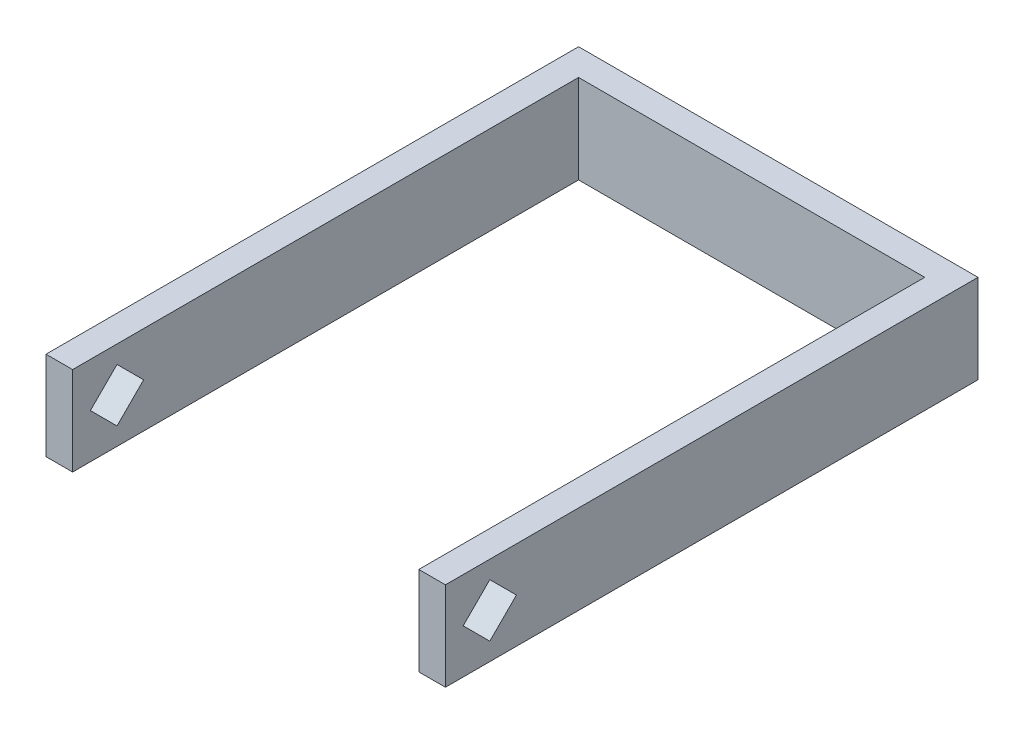
ISO-10303-21;
HEADER;
FILE_DESCRIPTION(('STEP AP214'),'2;1');
FILE_NAME('part.step','',(''),(''),'','','');
FILE_SCHEMA(('AUTOMOTIVE_DESIGN { 1 0 10303 214 1 1 1 1 }'));
ENDSEC;
DATA;
#1=APPLICATION_CONTEXT('core data for automotive mechanical design processes');
#2=APPLICATION_PROTOCOL_DEFINITION('international standard','automotive_design',2000,#1);
#3=PRODUCT_CONTEXT('',#1,'mechanical');
#4=PRODUCT('Part','Part','',(#3));
#5=PRODUCT_RELATED_PRODUCT_CATEGORY('part','',(#4));
#6=PRODUCT_DEFINITION_FORMATION('','',#4);
#7=PRODUCT_DEFINITION_CONTEXT('part definition',#1,'design');
#8=PRODUCT_DEFINITION('design','',#6,#7);
#9=PRODUCT_DEFINITION_SHAPE('','',#8);
#10=(LENGTH_UNIT() NAMED_UNIT(*) SI_UNIT(.MILLI.,.METRE.));
#11=(NAMED_UNIT(*) PLANE_ANGLE_UNIT() SI_UNIT($,.RADIAN.));
#12=(NAMED_UNIT(*) SI_UNIT($,.STERADIAN.) SOLID_ANGLE_UNIT());
#13=UNCERTAINTY_MEASURE_WITH_UNIT(LENGTH_MEASURE(1.E-05),#10,'distance_accuracy_value','');
#14=(GEOMETRIC_REPRESENTATION_CONTEXT(3) GLOBAL_UNCERTAINTY_ASSIGNED_CONTEXT((#13)) GLOBAL_UNIT_ASSIGNED_CONTEXT((#10,
#11,#12)) REPRESENTATION_CONTEXT('',''));
#15=CARTESIAN_POINT('',(0.,0.,0.));
#16=DIRECTION('',(0.,0.,1.));
#17=DIRECTION('',(1.,0.,0.));
#18=AXIS2_PLACEMENT_3D('',#15,#16,#17);
#19=CARTESIAN_POINT('',(19.5,10.,0.));
#20=DIRECTION('',(-1.,0.,0.));
#21=DIRECTION('',(0.,0.,1.));
#22=AXIS2_PLACEMENT_3D('',#19,#20,#21);
#23=PLANE('',#22);
#24=DIRECTION('',(0.,-0.707106781186547,-0.707106781186548));
#25=VECTOR('',#24,1.);
#26=CARTESIAN_POINT('',(19.5,-7.24999999999999,17.25));
#27=LINE('',#26,#25);
#28=CARTESIAN_POINT('',(19.5,8.00000000000001,32.5));
#29=VERTEX_POINT('',#28);
#30=CARTESIAN_POINT('',(19.5,5.,29.5));
#31=VERTEX_POINT('',#30);
#32=EDGE_CURVE('E199',#29,#31,#27,.T.);
#33=ORIENTED_EDGE('',*,*,#32,.F.);
#34=DIRECTION('',(0.,0.707106781186548,-0.707106781186547));
#35=VECTOR('',#34,1.);
#36=CARTESIAN_POINT('',(19.5,25.25,15.25));
#37=LINE('',#36,#35);
#38=CARTESIAN_POINT('',(19.5,5.,35.5));
#39=VERTEX_POINT('',#38);
#40=EDGE_CURVE('E187',#39,#29,#37,.T.);
#41=ORIENTED_EDGE('',*,*,#40,.F.);
#42=DIRECTION('',(0.,0.707106781186547,0.707106781186548));
#43=VECTOR('',#42,1.);
#44=CARTESIAN_POINT('',(19.5,-10.25,20.25));
#45=LINE('',#44,#43);
#46=CARTESIAN_POINT('',(19.5,2.,32.5));
#47=VERTEX_POINT('',#46);
#48=EDGE_CURVE('E195',#47,#39,#45,.T.);
#49=ORIENTED_EDGE('',*,*,#48,.F.);
#50=DIRECTION('',(0.,-0.707106781186546,0.707106781186549));
#51=VECTOR('',#50,1.);
#52=CARTESIAN_POINT('',(19.5,22.25,12.2499999999999));
#53=LINE('',#52,#51);
#54=EDGE_CURVE('E197',#31,#47,#53,.T.);
#55=ORIENTED_EDGE('',*,*,#54,.F.);
#56=EDGE_LOOP('',(#33,#41,#49,#55));
#57=FACE_BOUND('',#56,.T.);
#58=DIRECTION('',(0.,0.,-1.));
#59=VECTOR('',#58,1.);
#60=CARTESIAN_POINT('',(19.5,0.,0.));
#61=LINE('',#60,#59);
#62=CARTESIAN_POINT('',(19.5,0.,37.5));
#63=VERTEX_POINT('',#62);
#64=CARTESIAN_POINT('',(19.5,0.,-19.5));
#65=VERTEX_POINT('',#64);
#66=EDGE_CURVE('E201',#63,#65,#61,.T.);
#67=ORIENTED_EDGE('',*,*,#66,.F.);
#68=DIRECTION('',(0.,-1.,0.));
#69=VECTOR('',#68,1.);
#70=CARTESIAN_POINT('',(19.5,10.,37.5));
#71=LINE('',#70,#69);
#72=CARTESIAN_POINT('',(19.5,10.,37.5));
#73=VERTEX_POINT('',#72);
#74=EDGE_CURVE('E259',#73,#63,#71,.T.);
#75=ORIENTED_EDGE('',*,*,#74,.F.);
#76=DIRECTION('',(0.,0.,-1.));
#77=VECTOR('',#76,1.);
#78=CARTESIAN_POINT('',(19.5,10.,0.));
#79=LINE('',#78,#77);
#80=CARTESIAN_POINT('',(19.5,10.,-19.5));
#81=VERTEX_POINT('',#80);
#82=EDGE_CURVE('E202',#73,#81,#79,.T.);
#83=ORIENTED_EDGE('',*,*,#82,.T.);
#84=DIRECTION('',(0.,-1.,0.));
#85=VECTOR('',#84,1.);
#86=CARTESIAN_POINT('',(19.5,10.,-19.5));
#87=LINE('',#86,#85);
#88=EDGE_CURVE('E223',#81,#65,#87,.T.);
#89=ORIENTED_EDGE('',*,*,#88,.T.);
#90=EDGE_LOOP('',(#67,#75,#83,#89));
#91=FACE_BOUND('',#90,.T.);
#92=ADVANCED_FACE('F34',(#57,#91),#23,.T.);
#93=CARTESIAN_POINT('',(0.,10.,37.5));
#94=DIRECTION('',(0.,0.,-1.));
#95=DIRECTION('',(-1.,0.,0.));
#96=AXIS2_PLACEMENT_3D('',#93,#94,#95);
#97=PLANE('',#96);
#98=DIRECTION('',(1.,0.,0.));
#99=VECTOR('',#98,1.);
#100=CARTESIAN_POINT('',(0.,0.,37.5));
#101=LINE('',#100,#99);
#102=CARTESIAN_POINT('',(22.5,0.,37.5));
#103=VERTEX_POINT('',#102);
#104=EDGE_CURVE('E226',#63,#103,#101,.T.);
#105=ORIENTED_EDGE('',*,*,#104,.T.);
#106=DIRECTION('',(0.,-1.,0.));
#107=VECTOR('',#106,1.);
#108=CARTESIAN_POINT('',(22.5,10.,37.5));
#109=LINE('',#108,#107);
#110=CARTESIAN_POINT('',(22.5,10.,37.5));
#111=VERTEX_POINT('',#110);
#112=EDGE_CURVE('E256',#111,#103,#109,.T.);
#113=ORIENTED_EDGE('',*,*,#112,.F.);
#114=DIRECTION('',(1.,0.,0.));
#115=VECTOR('',#114,1.);
#116=CARTESIAN_POINT('',(0.,10.,37.5));
#117=LINE('',#116,#115);
#118=EDGE_CURVE('E205',#73,#111,#117,.T.);
#119=ORIENTED_EDGE('',*,*,#118,.F.);
#120=ORIENTED_EDGE('',*,*,#74,.T.);
#121=EDGE_LOOP('',(#105,#113,#119,#120));
#122=FACE_BOUND('',#121,.T.);
#123=ADVANCED_FACE('F288',(#122),#97,.F.);
#124=CARTESIAN_POINT('',(22.5,10.,0.));
#125=DIRECTION('',(-1.,0.,0.));
#126=DIRECTION('',(0.,0.,1.));
#127=AXIS2_PLACEMENT_3D('',#124,#125,#126);
#128=PLANE('',#127);
#129=DIRECTION('',(0.,-0.707106781186548,0.707106781186547));
#130=VECTOR('',#129,1.);
#131=CARTESIAN_POINT('',(22.5,8.00000000000001,32.5));
#132=LINE('',#131,#130);
#133=CARTESIAN_POINT('',(22.5,8.00000000000001,32.5));
#134=VERTEX_POINT('',#133);
#135=CARTESIAN_POINT('',(22.5,5.,35.5));
#136=VERTEX_POINT('',#135);
#137=EDGE_CURVE('E181',#134,#136,#132,.T.);
#138=ORIENTED_EDGE('',*,*,#137,.F.);
#139=DIRECTION('',(0.,0.707106781186547,0.707106781186547));
#140=VECTOR('',#139,1.);
#141=CARTESIAN_POINT('',(22.5,8.00000000000001,32.5));
#142=LINE('',#141,#140);
#143=CARTESIAN_POINT('',(22.5,5.,29.5));
#144=VERTEX_POINT('',#143);
#145=EDGE_CURVE('E56',#144,#134,#142,.T.);
#146=ORIENTED_EDGE('',*,*,#145,.F.);
#147=DIRECTION('',(0.,0.707106781186546,-0.707106781186549));
#148=VECTOR('',#147,1.);
#149=CARTESIAN_POINT('',(22.5,5.,29.5));
#150=LINE('',#149,#148);
#151=CARTESIAN_POINT('',(22.5,2.,32.5));
#152=VERTEX_POINT('',#151);
#153=EDGE_CURVE('E172',#152,#144,#150,.T.);
#154=ORIENTED_EDGE('',*,*,#153,.F.);
#155=DIRECTION('',(0.,-0.707106781186547,-0.707106781186548));
#156=VECTOR('',#155,1.);
#157=CARTESIAN_POINT('',(22.5,5.,35.5));
#158=LINE('',#157,#156);
#159=EDGE_CURVE('E175',#136,#152,#158,.T.);
#160=ORIENTED_EDGE('',*,*,#159,.F.);
#161=EDGE_LOOP('',(#138,#146,#154,#160));
#162=FACE_BOUND('',#161,.T.);
#163=DIRECTION('',(0.,0.,-1.));
#164=VECTOR('',#163,1.);
#165=CARTESIAN_POINT('',(22.5,0.,0.));
#166=LINE('',#165,#164);
#167=CARTESIAN_POINT('',(22.5,0.,-22.5));
#168=VERTEX_POINT('',#167);
#169=EDGE_CURVE('E228',#103,#168,#166,.T.);
#170=ORIENTED_EDGE('',*,*,#169,.T.);
#171=DIRECTION('',(0.,-1.,0.));
#172=VECTOR('',#171,1.);
#173=CARTESIAN_POINT('',(22.5,10.,-22.5));
#174=LINE('',#173,#172);
#175=CARTESIAN_POINT('',(22.5,10.,-22.5));
#176=VERTEX_POINT('',#175);
#177=EDGE_CURVE('E254',#176,#168,#174,.T.);
#178=ORIENTED_EDGE('',*,*,#177,.F.);
#179=DIRECTION('',(0.,0.,-1.));
#180=VECTOR('',#179,1.);
#181=CARTESIAN_POINT('',(22.5,10.,0.));
#182=LINE('',#181,#180);
#183=EDGE_CURVE('E208',#111,#176,#182,.T.);
#184=ORIENTED_EDGE('',*,*,#183,.F.);
#185=ORIENTED_EDGE('',*,*,#112,.T.);
#186=EDGE_LOOP('',(#170,#178,#184,#185));
#187=FACE_BOUND('',#186,.T.);
#188=ADVANCED_FACE('F293',(#162,#187),#128,.F.);
#189=CARTESIAN_POINT('',(0.,10.,-22.5));
#190=DIRECTION('',(0.,0.,-1.));
#191=DIRECTION('',(-1.,0.,0.));
#192=AXIS2_PLACEMENT_3D('',#189,#190,#191);
#193=PLANE('',#192);
#194=DIRECTION('',(1.,0.,0.));
#195=VECTOR('',#194,1.);
#196=CARTESIAN_POINT('',(0.,0.,-22.5));
#197=LINE('',#196,#195);
#198=CARTESIAN_POINT('',(-22.5,0.,-22.5));
#199=VERTEX_POINT('',#198);
#200=EDGE_CURVE('E231',#199,#168,#197,.T.);
#201=ORIENTED_EDGE('',*,*,#200,.F.);
#202=DIRECTION('',(0.,-1.,0.));
#203=VECTOR('',#202,1.);
#204=CARTESIAN_POINT('',(-22.5,10.,-22.5));
#205=LINE('',#204,#203);
#206=CARTESIAN_POINT('',(-22.5,10.,-22.5));
#207=VERTEX_POINT('',#206);
#208=EDGE_CURVE('E252',#207,#199,#205,.T.);
#209=ORIENTED_EDGE('',*,*,#208,.F.);
#210=DIRECTION('',(1.,0.,0.));
#211=VECTOR('',#210,1.);
#212=CARTESIAN_POINT('',(0.,10.,-22.5));
#213=LINE('',#212,#211);
#214=EDGE_CURVE('E210',#207,#176,#213,.T.);
#215=ORIENTED_EDGE('',*,*,#214,.T.);
#216=ORIENTED_EDGE('',*,*,#177,.T.);
#217=EDGE_LOOP('',(#201,#209,#215,#216));
#218=FACE_BOUND('',#217,.T.);
#219=ADVANCED_FACE('F327',(#218),#193,.T.);
#220=CARTESIAN_POINT('',(-22.5,10.,0.));
#221=DIRECTION('',(-1.,0.,0.));
#222=DIRECTION('',(0.,0.,1.));
#223=AXIS2_PLACEMENT_3D('',#220,#221,#222);
#224=PLANE('',#223);
#225=DIRECTION('',(0.,0.707106781186547,0.707106781186547));
#226=VECTOR('',#225,1.);
#227=CARTESIAN_POINT('',(-22.5,8.00000000000001,32.5));
#228=LINE('',#227,#226);
#229=CARTESIAN_POINT('',(-22.5,5.,29.5));
#230=VERTEX_POINT('',#229);
#231=CARTESIAN_POINT('',(-22.5,8.00000000000001,32.5));
#232=VERTEX_POINT('',#231);
#233=EDGE_CURVE('E151',#230,#232,#228,.T.);
#234=ORIENTED_EDGE('',*,*,#233,.T.);
#235=DIRECTION('',(0.,-0.707106781186548,0.707106781186547));
#236=VECTOR('',#235,1.);
#237=CARTESIAN_POINT('',(-22.5,8.00000000000001,32.5));
#238=LINE('',#237,#236);
#239=CARTESIAN_POINT('',(-22.5,5.,35.5));
#240=VERTEX_POINT('',#239);
#241=EDGE_CURVE('E160',#232,#240,#238,.T.);
#242=ORIENTED_EDGE('',*,*,#241,.T.);
#243=DIRECTION('',(0.,-0.707106781186547,-0.707106781186548));
#244=VECTOR('',#243,1.);
#245=CARTESIAN_POINT('',(-22.5,5.,35.5));
#246=LINE('',#245,#244);
#247=CARTESIAN_POINT('',(-22.5,2.,32.5));
#248=VERTEX_POINT('',#247);
#249=EDGE_CURVE('E166',#240,#248,#246,.T.);
#250=ORIENTED_EDGE('',*,*,#249,.T.);
#251=DIRECTION('',(0.,0.707106781186546,-0.707106781186549));
#252=VECTOR('',#251,1.);
#253=CARTESIAN_POINT('',(-22.5,5.,29.5));
#254=LINE('',#253,#252);
#255=EDGE_CURVE('E171',#248,#230,#254,.T.);
#256=ORIENTED_EDGE('',*,*,#255,.T.);
#257=EDGE_LOOP('',(#234,#242,#250,#256));
#258=FACE_BOUND('',#257,.T.);
#259=DIRECTION('',(0.,0.,-1.));
#260=VECTOR('',#259,1.);
#261=CARTESIAN_POINT('',(-22.5,0.,0.));
#262=LINE('',#261,#260);
#263=CARTESIAN_POINT('',(-22.5,0.,37.5));
#264=VERTEX_POINT('',#263);
#265=EDGE_CURVE('E234',#264,#199,#262,.T.);
#266=ORIENTED_EDGE('',*,*,#265,.F.);
#267=DIRECTION('',(0.,-1.,0.));
#268=VECTOR('',#267,1.);
#269=CARTESIAN_POINT('',(-22.5,10.,37.5));
#270=LINE('',#269,#268);
#271=CARTESIAN_POINT('',(-22.5,10.,37.5));
#272=VERTEX_POINT('',#271);
#273=EDGE_CURVE('E250',#272,#264,#270,.T.);
#274=ORIENTED_EDGE('',*,*,#273,.F.);
#275=DIRECTION('',(0.,0.,-1.));
#276=VECTOR('',#275,1.);
#277=CARTESIAN_POINT('',(-22.5,10.,0.));
#278=LINE('',#277,#276);
#279=EDGE_CURVE('E213',#272,#207,#278,.T.);
#280=ORIENTED_EDGE('',*,*,#279,.T.);
#281=ORIENTED_EDGE('',*,*,#208,.T.);
#282=EDGE_LOOP('',(#266,#274,#280,#281));
#283=FACE_BOUND('',#282,.T.);
#284=ADVANCED_FACE('F168',(#258,#283),#224,.T.);
#285=CARTESIAN_POINT('',(0.,10.,37.5));
#286=DIRECTION('',(0.,0.,-1.));
#287=DIRECTION('',(-1.,0.,0.));
#288=AXIS2_PLACEMENT_3D('',#285,#286,#287);
#289=PLANE('',#288);
#290=DIRECTION('',(1.,0.,0.));
#291=VECTOR('',#290,1.);
#292=CARTESIAN_POINT('',(0.,0.,37.5));
#293=LINE('',#292,#291);
#294=CARTESIAN_POINT('',(-19.5,0.,37.5));
#295=VERTEX_POINT('',#294);
#296=EDGE_CURVE('E237',#264,#295,#293,.T.);
#297=ORIENTED_EDGE('',*,*,#296,.T.);
#298=DIRECTION('',(0.,-1.,0.));
#299=VECTOR('',#298,1.);
#300=CARTESIAN_POINT('',(-19.5,10.,37.5));
#301=LINE('',#300,#299);
#302=CARTESIAN_POINT('',(-19.5,10.,37.5));
#303=VERTEX_POINT('',#302);
#304=EDGE_CURVE('E248',#303,#295,#301,.T.);
#305=ORIENTED_EDGE('',*,*,#304,.F.);
#306=DIRECTION('',(1.,0.,0.));
#307=VECTOR('',#306,1.);
#308=CARTESIAN_POINT('',(0.,10.,37.5));
#309=LINE('',#308,#307);
#310=EDGE_CURVE('E216',#272,#303,#309,.T.);
#311=ORIENTED_EDGE('',*,*,#310,.F.);
#312=ORIENTED_EDGE('',*,*,#273,.T.);
#313=EDGE_LOOP('',(#297,#305,#311,#312));
#314=FACE_BOUND('',#313,.T.);
#315=ADVANCED_FACE('F334',(#314),#289,.F.);
#316=CARTESIAN_POINT('',(-19.5,10.,0.));
#317=DIRECTION('',(1.,0.,0.));
#318=DIRECTION('',(0.,0.,-1.));
#319=AXIS2_PLACEMENT_3D('',#316,#317,#318);
#320=PLANE('',#319);
#321=DIRECTION('',(0.,0.707106781186547,0.707106781186548));
#322=VECTOR('',#321,1.);
#323=CARTESIAN_POINT('',(-19.5,-7.24999999999999,17.25));
#324=LINE('',#323,#322);
#325=CARTESIAN_POINT('',(-19.5,5.,29.5));
#326=VERTEX_POINT('',#325);
#327=CARTESIAN_POINT('',(-19.5,8.00000000000001,32.5));
#328=VERTEX_POINT('',#327);
#329=EDGE_CURVE('E11',#326,#328,#324,.T.);
#330=ORIENTED_EDGE('',*,*,#329,.F.);
#331=DIRECTION('',(0.,0.707106781186546,-0.707106781186549));
#332=VECTOR('',#331,1.);
#333=CARTESIAN_POINT('',(-19.5,22.25,12.2499999999999));
#334=LINE('',#333,#332);
#335=CARTESIAN_POINT('',(-19.5,2.,32.5));
#336=VERTEX_POINT('',#335);
#337=EDGE_CURVE('E41',#336,#326,#334,.T.);
#338=ORIENTED_EDGE('',*,*,#337,.F.);
#339=DIRECTION('',(0.,-0.707106781186547,-0.707106781186548));
#340=VECTOR('',#339,1.);
#341=CARTESIAN_POINT('',(-19.5,-10.25,20.25));
#342=LINE('',#341,#340);
#343=CARTESIAN_POINT('',(-19.5,5.,35.5));
#344=VERTEX_POINT('',#343);
#345=EDGE_CURVE('E263',#344,#336,#342,.T.);
#346=ORIENTED_EDGE('',*,*,#345,.F.);
#347=DIRECTION('',(0.,-0.707106781186548,0.707106781186547));
#348=VECTOR('',#347,1.);
#349=CARTESIAN_POINT('',(-19.5,25.25,15.25));
#350=LINE('',#349,#348);
#351=EDGE_CURVE('E261',#328,#344,#350,.T.);
#352=ORIENTED_EDGE('',*,*,#351,.F.);
#353=EDGE_LOOP('',(#330,#338,#346,#352));
#354=FACE_BOUND('',#353,.T.);
#355=DIRECTION('',(0.,0.,1.));
#356=VECTOR('',#355,1.);
#357=CARTESIAN_POINT('',(-19.5,0.,0.));
#358=LINE('',#357,#356);
#359=CARTESIAN_POINT('',(-19.5,0.,-19.5));
#360=VERTEX_POINT('',#359);
#361=EDGE_CURVE('E240',#360,#295,#358,.T.);
#362=ORIENTED_EDGE('',*,*,#361,.F.);
#363=DIRECTION('',(0.,-1.,0.));
#364=VECTOR('',#363,1.);
#365=CARTESIAN_POINT('',(-19.5,10.,-19.5));
#366=LINE('',#365,#364);
#367=CARTESIAN_POINT('',(-19.5,10.,-19.5));
#368=VERTEX_POINT('',#367);
#369=EDGE_CURVE('E246',#368,#360,#366,.T.);
#370=ORIENTED_EDGE('',*,*,#369,.F.);
#371=DIRECTION('',(0.,0.,1.));
#372=VECTOR('',#371,1.);
#373=CARTESIAN_POINT('',(-19.5,10.,0.));
#374=LINE('',#373,#372);
#375=EDGE_CURVE('E218',#368,#303,#374,.T.);
#376=ORIENTED_EDGE('',*,*,#375,.T.);
#377=ORIENTED_EDGE('',*,*,#304,.T.);
#378=EDGE_LOOP('',(#362,#370,#376,#377));
#379=FACE_BOUND('',#378,.T.);
#380=ADVANCED_FACE('F269',(#354,#379),#320,.T.);
#381=CARTESIAN_POINT('',(0.,10.,-19.5));
#382=DIRECTION('',(0.,0.,-1.));
#383=DIRECTION('',(-1.,0.,0.));
#384=AXIS2_PLACEMENT_3D('',#381,#382,#383);
#385=PLANE('',#384);
#386=DIRECTION('',(1.,0.,0.));
#387=VECTOR('',#386,1.);
#388=CARTESIAN_POINT('',(0.,0.,-19.5));
#389=LINE('',#388,#387);
#390=EDGE_CURVE('E206',#360,#65,#389,.T.);
#391=ORIENTED_EDGE('',*,*,#390,.T.);
#392=ORIENTED_EDGE('',*,*,#88,.F.);
#393=DIRECTION('',(1.,0.,0.));
#394=VECTOR('',#393,1.);
#395=CARTESIAN_POINT('',(0.,10.,-19.5));
#396=LINE('',#395,#394);
#397=EDGE_CURVE('E221',#368,#81,#396,.T.);
#398=ORIENTED_EDGE('',*,*,#397,.F.);
#399=ORIENTED_EDGE('',*,*,#369,.T.);
#400=EDGE_LOOP('',(#391,#392,#398,#399));
#401=FACE_BOUND('',#400,.T.);
#402=ADVANCED_FACE('F319',(#401),#385,.F.);
#403=CARTESIAN_POINT('',(0.,10.,0.));
#404=DIRECTION('',(0.,1.,0.));
#405=DIRECTION('',(0.,0.,1.));
#406=AXIS2_PLACEMENT_3D('',#403,#404,#405);
#407=PLANE('',#406);
#408=ORIENTED_EDGE('',*,*,#82,.F.);
#409=ORIENTED_EDGE('',*,*,#118,.T.);
#410=ORIENTED_EDGE('',*,*,#183,.T.);
#411=ORIENTED_EDGE('',*,*,#214,.F.);
#412=ORIENTED_EDGE('',*,*,#279,.F.);
#413=ORIENTED_EDGE('',*,*,#310,.T.);
#414=ORIENTED_EDGE('',*,*,#375,.F.);
#415=ORIENTED_EDGE('',*,*,#397,.T.);
#416=EDGE_LOOP('',(#408,#409,#410,#411,#412,#413,#414,#415));
#417=FACE_BOUND('',#416,.T.);
#418=ADVANCED_FACE('F314',(#417),#407,.T.);
#419=CARTESIAN_POINT('',(0.,0.,0.));
#420=DIRECTION('',(0.,1.,0.));
#421=DIRECTION('',(0.,0.,1.));
#422=AXIS2_PLACEMENT_3D('',#419,#420,#421);
#423=PLANE('',#422);
#424=ORIENTED_EDGE('',*,*,#66,.T.);
#425=ORIENTED_EDGE('',*,*,#390,.F.);
#426=ORIENTED_EDGE('',*,*,#361,.T.);
#427=ORIENTED_EDGE('',*,*,#296,.F.);
#428=ORIENTED_EDGE('',*,*,#265,.T.);
#429=ORIENTED_EDGE('',*,*,#200,.T.);
#430=ORIENTED_EDGE('',*,*,#169,.F.);
#431=ORIENTED_EDGE('',*,*,#104,.F.);
#432=EDGE_LOOP('',(#424,#425,#426,#427,#428,#429,#430,#431));
#433=FACE_BOUND('',#432,.T.);
#434=ADVANCED_FACE('F282',(#433),#423,.F.);
#435=CARTESIAN_POINT('',(-22.5,8.00000000000001,32.5));
#436=DIRECTION('',(0.,0.707106781186547,0.707106781186548));
#437=DIRECTION('',(0.,-0.707106781186548,0.707106781186547));
#438=AXIS2_PLACEMENT_3D('',#435,#436,#437);
#439=PLANE('',#438);
#440=ORIENTED_EDGE('',*,*,#351,.T.);
#441=DIRECTION('',(1.,0.,0.));
#442=VECTOR('',#441,1.);
#443=CARTESIAN_POINT('',(-22.5,5.,35.5));
#444=LINE('',#443,#442);
#445=EDGE_CURVE('E163',#240,#344,#444,.T.);
#446=ORIENTED_EDGE('',*,*,#445,.F.);
#447=ORIENTED_EDGE('',*,*,#241,.F.);
#448=DIRECTION('',(1.,0.,0.));
#449=VECTOR('',#448,1.);
#450=CARTESIAN_POINT('',(-22.5,8.00000000000001,32.5));
#451=LINE('',#450,#449);
#452=EDGE_CURVE('E146',#232,#328,#451,.T.);
#453=ORIENTED_EDGE('',*,*,#452,.T.);
#454=EDGE_LOOP('',(#440,#446,#447,#453));
#455=FACE_BOUND('',#454,.T.);
#456=ADVANCED_FACE('F161',(#455),#439,.F.);
#457=CARTESIAN_POINT('',(-22.5,5.,35.5));
#458=DIRECTION('',(0.,-0.707106781186548,0.707106781186547));
#459=DIRECTION('',(0.,-0.707106781186547,-0.707106781186548));
#460=AXIS2_PLACEMENT_3D('',#457,#458,#459);
#461=PLANE('',#460);
#462=ORIENTED_EDGE('',*,*,#345,.T.);
#463=DIRECTION('',(1.,0.,0.));
#464=VECTOR('',#463,1.);
#465=CARTESIAN_POINT('',(-22.5,2.,32.5));
#466=LINE('',#465,#464);
#467=EDGE_CURVE('E189',#248,#336,#466,.T.);
#468=ORIENTED_EDGE('',*,*,#467,.F.);
#469=ORIENTED_EDGE('',*,*,#249,.F.);
#470=ORIENTED_EDGE('',*,*,#445,.T.);
#471=EDGE_LOOP('',(#462,#468,#469,#470));
#472=FACE_BOUND('',#471,.T.);
#473=ADVANCED_FACE('F272',(#472),#461,.F.);
#474=CARTESIAN_POINT('',(-22.5,5.,29.5));
#475=DIRECTION('',(0.,-0.707106781186549,-0.707106781186546));
#476=DIRECTION('',(0.,0.707106781186546,-0.707106781186549));
#477=AXIS2_PLACEMENT_3D('',#474,#475,#476);
#478=PLANE('',#477);
#479=ORIENTED_EDGE('',*,*,#337,.T.);
#480=DIRECTION('',(1.,0.,0.));
#481=VECTOR('',#480,1.);
#482=CARTESIAN_POINT('',(-22.5,5.,29.5));
#483=LINE('',#482,#481);
#484=EDGE_CURVE('E185',#230,#326,#483,.T.);
#485=ORIENTED_EDGE('',*,*,#484,.F.);
#486=ORIENTED_EDGE('',*,*,#255,.F.);
#487=ORIENTED_EDGE('',*,*,#467,.T.);
#488=EDGE_LOOP('',(#479,#485,#486,#487));
#489=FACE_BOUND('',#488,.T.);
#490=ADVANCED_FACE('F266',(#489),#478,.F.);
#491=CARTESIAN_POINT('',(-22.5,8.00000000000001,32.5));
#492=DIRECTION('',(0.,0.707106781186548,-0.707106781186547));
#493=DIRECTION('',(0.,0.707106781186547,0.707106781186548));
#494=AXIS2_PLACEMENT_3D('',#491,#492,#493);
#495=PLANE('',#494);
#496=ORIENTED_EDGE('',*,*,#329,.T.);
#497=ORIENTED_EDGE('',*,*,#452,.F.);
#498=ORIENTED_EDGE('',*,*,#233,.F.);
#499=ORIENTED_EDGE('',*,*,#484,.T.);
#500=EDGE_LOOP('',(#496,#497,#498,#499));
#501=FACE_BOUND('',#500,.T.);
#502=ADVANCED_FACE('F148',(#501),#495,.F.);
#503=ORIENTED_EDGE('',*,*,#32,.T.);
#504=EDGE_CURVE('E188',#31,#144,#483,.T.);
#505=ORIENTED_EDGE('',*,*,#504,.T.);
#506=ORIENTED_EDGE('',*,*,#145,.T.);
#507=EDGE_CURVE('E156',#29,#134,#451,.T.);
#508=ORIENTED_EDGE('',*,*,#507,.F.);
#509=EDGE_LOOP('',(#503,#505,#506,#508));
#510=FACE_BOUND('',#509,.T.);
#511=ADVANCED_FACE('F350',(#510),#495,.F.);
#512=ORIENTED_EDGE('',*,*,#54,.T.);
#513=EDGE_CURVE('E192',#47,#152,#466,.T.);
#514=ORIENTED_EDGE('',*,*,#513,.T.);
#515=ORIENTED_EDGE('',*,*,#153,.T.);
#516=ORIENTED_EDGE('',*,*,#504,.F.);
#517=EDGE_LOOP('',(#512,#514,#515,#516));
#518=FACE_BOUND('',#517,.T.);
#519=ADVANCED_FACE('F281',(#518),#478,.F.);
#520=ORIENTED_EDGE('',*,*,#48,.T.);
#521=EDGE_CURVE('E48',#39,#136,#444,.T.);
#522=ORIENTED_EDGE('',*,*,#521,.T.);
#523=ORIENTED_EDGE('',*,*,#159,.T.);
#524=ORIENTED_EDGE('',*,*,#513,.F.);
#525=EDGE_LOOP('',(#520,#522,#523,#524));
#526=FACE_BOUND('',#525,.T.);
#527=ADVANCED_FACE('F275',(#526),#461,.F.);
#528=ORIENTED_EDGE('',*,*,#40,.T.);
#529=ORIENTED_EDGE('',*,*,#507,.T.);
#530=ORIENTED_EDGE('',*,*,#137,.T.);
#531=ORIENTED_EDGE('',*,*,#521,.F.);
#532=EDGE_LOOP('',(#528,#529,#530,#531));
#533=FACE_BOUND('',#532,.T.);
#534=ADVANCED_FACE('F284',(#533),#439,.F.);
#535=CLOSED_SHELL('',(#92,#123,#188,#219,#284,#315,#380,#402,#418,#434,#456,#473,#490,#502,#511,
#519,#527,#534));
#536=MANIFOLD_SOLID_BREP('B2',#535);
#537=ADVANCED_BREP_SHAPE_REPRESENTATION('',(#18,#536),#14);
#538=SHAPE_DEFINITION_REPRESENTATION(#9,#537);
ENDSEC;
END-ISO-10303-21;
